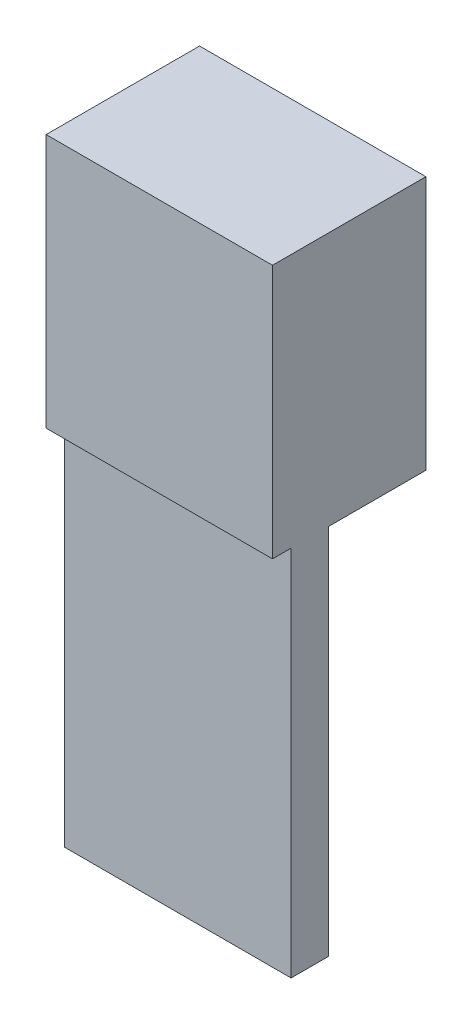
ISO-10303-21;
HEADER;
FILE_DESCRIPTION(('STEP AP214'),'2;1');
FILE_NAME('part.step','',(''),(''),'','','');
FILE_SCHEMA(('AUTOMOTIVE_DESIGN { 1 0 10303 214 1 1 1 1 }'));
ENDSEC;
DATA;
#1=APPLICATION_CONTEXT('core data for automotive mechanical design processes');
#2=APPLICATION_PROTOCOL_DEFINITION('international standard','automotive_design',2000,#1);
#3=PRODUCT_CONTEXT('',#1,'mechanical');
#4=PRODUCT('Part','Part','',(#3));
#5=PRODUCT_RELATED_PRODUCT_CATEGORY('part','',(#4));
#6=PRODUCT_DEFINITION_FORMATION('','',#4);
#7=PRODUCT_DEFINITION_CONTEXT('part definition',#1,'design');
#8=PRODUCT_DEFINITION('design','',#6,#7);
#9=PRODUCT_DEFINITION_SHAPE('','',#8);
#10=(LENGTH_UNIT() NAMED_UNIT(*) SI_UNIT(.MILLI.,.METRE.));
#11=(NAMED_UNIT(*) PLANE_ANGLE_UNIT() SI_UNIT($,.RADIAN.));
#12=(NAMED_UNIT(*) SI_UNIT($,.STERADIAN.) SOLID_ANGLE_UNIT());
#13=UNCERTAINTY_MEASURE_WITH_UNIT(LENGTH_MEASURE(1.E-05),#10,'distance_accuracy_value','');
#14=(GEOMETRIC_REPRESENTATION_CONTEXT(3) GLOBAL_UNCERTAINTY_ASSIGNED_CONTEXT((#13)) GLOBAL_UNIT_ASSIGNED_CONTEXT((#10,
#11,#12)) REPRESENTATION_CONTEXT('',''));
#15=CARTESIAN_POINT('',(0.,0.,0.));
#16=DIRECTION('',(0.,0.,1.));
#17=DIRECTION('',(1.,0.,0.));
#18=AXIS2_PLACEMENT_3D('',#15,#16,#17);
#19=CARTESIAN_POINT('',(-3.04,-3.415,4.12));
#20=DIRECTION('',(0.,1.,0.));
#21=DIRECTION('',(0.,0.,1.));
#22=AXIS2_PLACEMENT_3D('',#19,#20,#21);
#23=PLANE('',#22);
#24=DIRECTION('',(1.,0.,0.));
#25=VECTOR('',#24,1.);
#26=CARTESIAN_POINT('',(3.04,-3.415,2.62));
#27=LINE('',#26,#25);
#28=CARTESIAN_POINT('',(-3.04,-3.415,2.62));
#29=VERTEX_POINT('',#28);
#30=CARTESIAN_POINT('',(3.04,-3.415,2.62));
#31=VERTEX_POINT('',#30);
#32=EDGE_CURVE('E51',#29,#31,#27,.T.);
#33=ORIENTED_EDGE('',*,*,#32,.F.);
#34=DIRECTION('',(0.,0.,-1.));
#35=VECTOR('',#34,1.);
#36=CARTESIAN_POINT('',(-3.04,-3.415,4.12));
#37=LINE('',#36,#35);
#38=CARTESIAN_POINT('',(-3.04,-3.415,0.));
#39=VERTEX_POINT('',#38);
#40=EDGE_CURVE('E177',#29,#39,#37,.T.);
#41=ORIENTED_EDGE('',*,*,#40,.T.);
#42=DIRECTION('',(1.,0.,0.));
#43=VECTOR('',#42,1.);
#44=CARTESIAN_POINT('',(-3.04,-3.415,0.));
#45=LINE('',#44,#43);
#46=CARTESIAN_POINT('',(3.04,-3.415,0.));
#47=VERTEX_POINT('',#46);
#48=EDGE_CURVE('E160',#39,#47,#45,.T.);
#49=ORIENTED_EDGE('',*,*,#48,.T.);
#50=DIRECTION('',(0.,0.,-1.));
#51=VECTOR('',#50,1.);
#52=CARTESIAN_POINT('',(3.04,-3.415,4.12));
#53=LINE('',#52,#51);
#54=EDGE_CURVE('E56',#31,#47,#53,.T.);
#55=ORIENTED_EDGE('',*,*,#54,.F.);
#56=EDGE_LOOP('',(#33,#41,#49,#55));
#57=FACE_BOUND('',#56,.T.);
#58=ADVANCED_FACE('F34',(#57),#23,.F.);
#59=DIRECTION('',(-1.,0.,0.));
#60=VECTOR('',#59,1.);
#61=CARTESIAN_POINT('',(3.04,-3.415,3.62));
#62=LINE('',#61,#60);
#63=CARTESIAN_POINT('',(3.04,-3.415,3.62));
#64=VERTEX_POINT('',#63);
#65=CARTESIAN_POINT('',(-3.04,-3.415,3.62));
#66=VERTEX_POINT('',#65);
#67=EDGE_CURVE('E139',#64,#66,#62,.T.);
#68=ORIENTED_EDGE('',*,*,#67,.F.);
#69=CARTESIAN_POINT('',(3.04,-3.415,4.12));
#70=VERTEX_POINT('',#69);
#71=EDGE_CURVE('E124',#70,#64,#53,.T.);
#72=ORIENTED_EDGE('',*,*,#71,.F.);
#73=DIRECTION('',(1.,0.,0.));
#74=VECTOR('',#73,1.);
#75=CARTESIAN_POINT('',(-3.04,-3.415,4.12));
#76=LINE('',#75,#74);
#77=CARTESIAN_POINT('',(-3.04,-3.415,4.12));
#78=VERTEX_POINT('',#77);
#79=EDGE_CURVE('E150',#78,#70,#76,.T.);
#80=ORIENTED_EDGE('',*,*,#79,.F.);
#81=EDGE_CURVE('E43',#78,#66,#37,.T.);
#82=ORIENTED_EDGE('',*,*,#81,.T.);
#83=EDGE_LOOP('',(#68,#72,#80,#82));
#84=FACE_BOUND('',#83,.T.);
#85=ADVANCED_FACE('F198',(#84),#23,.F.);
#86=CARTESIAN_POINT('',(-3.04,-3.415,0.));
#87=DIRECTION('',(0.,0.,1.));
#88=DIRECTION('',(1.,0.,0.));
#89=AXIS2_PLACEMENT_3D('',#86,#87,#88);
#90=PLANE('',#89);
#91=DIRECTION('',(0.,-1.,0.));
#92=VECTOR('',#91,1.);
#93=CARTESIAN_POINT('',(-3.04,3.415,0.));
#94=LINE('',#93,#92);
#95=CARTESIAN_POINT('',(-3.04,3.415,0.));
#96=VERTEX_POINT('',#95);
#97=EDGE_CURVE('E128',#96,#39,#94,.T.);
#98=ORIENTED_EDGE('',*,*,#97,.F.);
#99=DIRECTION('',(-1.,0.,0.));
#100=VECTOR('',#99,1.);
#101=CARTESIAN_POINT('',(-3.04,3.415,0.));
#102=LINE('',#101,#100);
#103=CARTESIAN_POINT('',(3.04,3.415,0.));
#104=VERTEX_POINT('',#103);
#105=EDGE_CURVE('E151',#104,#96,#102,.T.);
#106=ORIENTED_EDGE('',*,*,#105,.F.);
#107=DIRECTION('',(0.,1.,0.));
#108=VECTOR('',#107,1.);
#109=CARTESIAN_POINT('',(3.04,3.415,0.));
#110=LINE('',#109,#108);
#111=EDGE_CURVE('E162',#47,#104,#110,.T.);
#112=ORIENTED_EDGE('',*,*,#111,.F.);
#113=ORIENTED_EDGE('',*,*,#48,.F.);
#114=EDGE_LOOP('',(#98,#106,#112,#113));
#115=FACE_BOUND('',#114,.T.);
#116=CARTESIAN_POINT('',(0.,0.565000000000001,0.));
#117=DIRECTION('',(0.,0.,1.));
#118=DIRECTION('',(1.,0.,0.));
#119=AXIS2_PLACEMENT_3D('',#116,#117,#118);
#120=CIRCLE('',#119,2.35);
#121=CARTESIAN_POINT('',(2.35,0.565000000000001,0.));
#122=VERTEX_POINT('',#121);
#123=EDGE_CURVE('E11',#122,#122,#120,.F.);
#124=ORIENTED_EDGE('',*,*,#123,.F.);
#125=EDGE_LOOP('',(#124));
#126=FACE_BOUND('',#125,.T.);
#127=ADVANCED_FACE('F185',(#115,#126),#90,.F.);
#128=CARTESIAN_POINT('',(-3.04,3.415,4.12));
#129=DIRECTION('',(1.,0.,0.));
#130=DIRECTION('',(0.,0.,-1.));
#131=AXIS2_PLACEMENT_3D('',#128,#129,#130);
#132=PLANE('',#131);
#133=ORIENTED_EDGE('',*,*,#97,.T.);
#134=ORIENTED_EDGE('',*,*,#40,.F.);
#135=DIRECTION('',(0.,1.,0.));
#136=VECTOR('',#135,1.);
#137=CARTESIAN_POINT('',(-3.04,-13.415,2.62));
#138=LINE('',#137,#136);
#139=CARTESIAN_POINT('',(-3.04,-13.415,2.62));
#140=VERTEX_POINT('',#139);
#141=EDGE_CURVE('E130',#140,#29,#138,.T.);
#142=ORIENTED_EDGE('',*,*,#141,.F.);
#143=DIRECTION('',(0.,0.,-1.));
#144=VECTOR('',#143,1.);
#145=CARTESIAN_POINT('',(-3.04,-13.415,3.62));
#146=LINE('',#145,#144);
#147=CARTESIAN_POINT('',(-3.04,-13.415,3.62));
#148=VERTEX_POINT('',#147);
#149=EDGE_CURVE('E109',#148,#140,#146,.T.);
#150=ORIENTED_EDGE('',*,*,#149,.F.);
#151=DIRECTION('',(0.,1.,0.));
#152=VECTOR('',#151,1.);
#153=CARTESIAN_POINT('',(-3.04,-13.415,3.62));
#154=LINE('',#153,#152);
#155=EDGE_CURVE('E106',#148,#66,#154,.T.);
#156=ORIENTED_EDGE('',*,*,#155,.T.);
#157=ORIENTED_EDGE('',*,*,#81,.F.);
#158=DIRECTION('',(0.,-1.,0.));
#159=VECTOR('',#158,1.);
#160=CARTESIAN_POINT('',(-3.04,3.415,4.12));
#161=LINE('',#160,#159);
#162=CARTESIAN_POINT('',(-3.04,3.415,4.12));
#163=VERTEX_POINT('',#162);
#164=EDGE_CURVE('E147',#163,#78,#161,.T.);
#165=ORIENTED_EDGE('',*,*,#164,.F.);
#166=DIRECTION('',(0.,0.,-1.));
#167=VECTOR('',#166,1.);
#168=CARTESIAN_POINT('',(-3.04,3.415,4.12));
#169=LINE('',#168,#167);
#170=EDGE_CURVE('E157',#163,#96,#169,.T.);
#171=ORIENTED_EDGE('',*,*,#170,.T.);
#172=EDGE_LOOP('',(#133,#134,#142,#150,#156,#157,#165,#171));
#173=FACE_BOUND('',#172,.T.);
#174=ADVANCED_FACE('F193',(#173),#132,.F.);
#175=CARTESIAN_POINT('',(3.04,3.415,4.12));
#176=DIRECTION('',(-1.,0.,0.));
#177=DIRECTION('',(0.,0.,1.));
#178=AXIS2_PLACEMENT_3D('',#175,#176,#177);
#179=PLANE('',#178);
#180=ORIENTED_EDGE('',*,*,#111,.T.);
#181=DIRECTION('',(0.,0.,-1.));
#182=VECTOR('',#181,1.);
#183=CARTESIAN_POINT('',(3.04,3.415,4.12));
#184=LINE('',#183,#182);
#185=CARTESIAN_POINT('',(3.04,3.415,4.12));
#186=VERTEX_POINT('',#185);
#187=EDGE_CURVE('E167',#186,#104,#184,.T.);
#188=ORIENTED_EDGE('',*,*,#187,.F.);
#189=DIRECTION('',(0.,1.,0.));
#190=VECTOR('',#189,1.);
#191=CARTESIAN_POINT('',(3.04,3.415,4.12));
#192=LINE('',#191,#190);
#193=EDGE_CURVE('E153',#70,#186,#192,.T.);
#194=ORIENTED_EDGE('',*,*,#193,.F.);
#195=ORIENTED_EDGE('',*,*,#71,.T.);
#196=DIRECTION('',(0.,1.,0.));
#197=VECTOR('',#196,1.);
#198=CARTESIAN_POINT('',(3.04,-13.415,3.62));
#199=LINE('',#198,#197);
#200=CARTESIAN_POINT('',(3.04,-13.415,3.62));
#201=VERTEX_POINT('',#200);
#202=EDGE_CURVE('E104',#201,#64,#199,.T.);
#203=ORIENTED_EDGE('',*,*,#202,.F.);
#204=DIRECTION('',(0.,0.,1.));
#205=VECTOR('',#204,1.);
#206=CARTESIAN_POINT('',(3.04,-13.415,3.62));
#207=LINE('',#206,#205);
#208=CARTESIAN_POINT('',(3.04,-13.415,2.62));
#209=VERTEX_POINT('',#208);
#210=EDGE_CURVE('E110',#209,#201,#207,.T.);
#211=ORIENTED_EDGE('',*,*,#210,.F.);
#212=DIRECTION('',(0.,1.,0.));
#213=VECTOR('',#212,1.);
#214=CARTESIAN_POINT('',(3.04,-13.415,2.62));
#215=LINE('',#214,#213);
#216=EDGE_CURVE('E140',#209,#31,#215,.T.);
#217=ORIENTED_EDGE('',*,*,#216,.T.);
#218=ORIENTED_EDGE('',*,*,#54,.T.);
#219=EDGE_LOOP('',(#180,#188,#194,#195,#203,#211,#217,#218));
#220=FACE_BOUND('',#219,.T.);
#221=ADVANCED_FACE('F121',(#220),#179,.F.);
#222=CARTESIAN_POINT('',(-3.04,3.415,4.12));
#223=DIRECTION('',(0.,-1.,0.));
#224=DIRECTION('',(0.,0.,-1.));
#225=AXIS2_PLACEMENT_3D('',#222,#223,#224);
#226=PLANE('',#225);
#227=ORIENTED_EDGE('',*,*,#105,.T.);
#228=ORIENTED_EDGE('',*,*,#170,.F.);
#229=DIRECTION('',(-1.,0.,0.));
#230=VECTOR('',#229,1.);
#231=CARTESIAN_POINT('',(-3.04,3.415,4.12));
#232=LINE('',#231,#230);
#233=EDGE_CURVE('E155',#186,#163,#232,.T.);
#234=ORIENTED_EDGE('',*,*,#233,.F.);
#235=ORIENTED_EDGE('',*,*,#187,.T.);
#236=EDGE_LOOP('',(#227,#228,#234,#235));
#237=FACE_BOUND('',#236,.T.);
#238=ADVANCED_FACE('F189',(#237),#226,.F.);
#239=CARTESIAN_POINT('',(-3.04,-3.415,4.12));
#240=DIRECTION('',(0.,0.,1.));
#241=DIRECTION('',(1.,0.,0.));
#242=AXIS2_PLACEMENT_3D('',#239,#240,#241);
#243=PLANE('',#242);
#244=ORIENTED_EDGE('',*,*,#164,.T.);
#245=ORIENTED_EDGE('',*,*,#79,.T.);
#246=ORIENTED_EDGE('',*,*,#193,.T.);
#247=ORIENTED_EDGE('',*,*,#233,.T.);
#248=EDGE_LOOP('',(#244,#245,#246,#247));
#249=FACE_BOUND('',#248,.T.);
#250=ADVANCED_FACE('F196',(#249),#243,.T.);
#251=CARTESIAN_POINT('',(0.,0.565000000000001,-0.1));
#252=DIRECTION('',(0.,0.,1.));
#253=DIRECTION('',(1.,0.,0.));
#254=AXIS2_PLACEMENT_3D('',#251,#252,#253);
#255=CYLINDRICAL_SURFACE('',#254,2.35);
#256=CARTESIAN_POINT('',(0.,0.565000000000001,-0.1));
#257=DIRECTION('',(0.,0.,-1.));
#258=DIRECTION('',(-1.,0.,0.));
#259=AXIS2_PLACEMENT_3D('',#256,#257,#258);
#260=CIRCLE('',#259,2.35);
#261=CARTESIAN_POINT('',(-2.35,0.565000000000001,-0.1));
#262=VERTEX_POINT('',#261);
#263=EDGE_CURVE('E125',#262,#262,#260,.T.);
#264=ORIENTED_EDGE('',*,*,#263,.F.);
#265=EDGE_LOOP('',(#264));
#266=FACE_BOUND('',#265,.T.);
#267=ORIENTED_EDGE('',*,*,#123,.T.);
#268=EDGE_LOOP('',(#267));
#269=FACE_BOUND('',#268,.T.);
#270=ADVANCED_FACE('F235',(#266,#269),#255,.T.);
#271=CARTESIAN_POINT('',(0.,0.565000000000001,1.07931034482759));
#272=DIRECTION('',(0.,0.,1.));
#273=DIRECTION('',(1.,0.,0.));
#274=AXIS2_PLACEMENT_3D('',#271,#272,#273);
#275=SPHERICAL_SURFACE('',#274,2.62931034482759);
#276=ORIENTED_EDGE('',*,*,#263,.T.);
#277=EDGE_LOOP('',(#276));
#278=FACE_BOUND('',#277,.T.);
#279=ADVANCED_FACE('F36',(#278),#275,.T.);
#280=CARTESIAN_POINT('',(3.04,-13.415,3.62));
#281=DIRECTION('',(0.,0.,-1.));
#282=DIRECTION('',(-1.,0.,0.));
#283=AXIS2_PLACEMENT_3D('',#280,#281,#282);
#284=PLANE('',#283);
#285=ORIENTED_EDGE('',*,*,#67,.T.);
#286=ORIENTED_EDGE('',*,*,#155,.F.);
#287=DIRECTION('',(-1.,0.,0.));
#288=VECTOR('',#287,1.);
#289=CARTESIAN_POINT('',(3.04,-13.415,3.62));
#290=LINE('',#289,#288);
#291=EDGE_CURVE('E99',#201,#148,#290,.T.);
#292=ORIENTED_EDGE('',*,*,#291,.F.);
#293=ORIENTED_EDGE('',*,*,#202,.T.);
#294=EDGE_LOOP('',(#285,#286,#292,#293));
#295=FACE_BOUND('',#294,.T.);
#296=ADVANCED_FACE('F102',(#295),#284,.F.);
#297=CARTESIAN_POINT('',(3.04,-13.415,2.62));
#298=DIRECTION('',(0.,0.,1.));
#299=DIRECTION('',(1.,0.,0.));
#300=AXIS2_PLACEMENT_3D('',#297,#298,#299);
#301=PLANE('',#300);
#302=ORIENTED_EDGE('',*,*,#32,.T.);
#303=ORIENTED_EDGE('',*,*,#216,.F.);
#304=DIRECTION('',(1.,0.,0.));
#305=VECTOR('',#304,1.);
#306=CARTESIAN_POINT('',(3.04,-13.415,2.62));
#307=LINE('',#306,#305);
#308=EDGE_CURVE('E115',#140,#209,#307,.T.);
#309=ORIENTED_EDGE('',*,*,#308,.F.);
#310=ORIENTED_EDGE('',*,*,#141,.T.);
#311=EDGE_LOOP('',(#302,#303,#309,#310));
#312=FACE_BOUND('',#311,.T.);
#313=ADVANCED_FACE('F205',(#312),#301,.F.);
#314=CARTESIAN_POINT('',(0.,-13.415,0.));
#315=DIRECTION('',(0.,1.,0.));
#316=DIRECTION('',(0.,0.,1.));
#317=AXIS2_PLACEMENT_3D('',#314,#315,#316);
#318=PLANE('',#317);
#319=ORIENTED_EDGE('',*,*,#210,.T.);
#320=ORIENTED_EDGE('',*,*,#291,.T.);
#321=ORIENTED_EDGE('',*,*,#149,.T.);
#322=ORIENTED_EDGE('',*,*,#308,.T.);
#323=EDGE_LOOP('',(#319,#320,#321,#322));
#324=FACE_BOUND('',#323,.T.);
#325=ADVANCED_FACE('F113',(#324),#318,.F.);
#326=CLOSED_SHELL('',(#58,#85,#127,#174,#221,#238,#250,#270,#279,#296,#313,#325));
#327=MANIFOLD_SOLID_BREP('B2',#326);
#328=ADVANCED_BREP_SHAPE_REPRESENTATION('',(#18,#327),#14);
#329=SHAPE_DEFINITION_REPRESENTATION(#9,#328);
ENDSEC;
END-ISO-10303-21;
